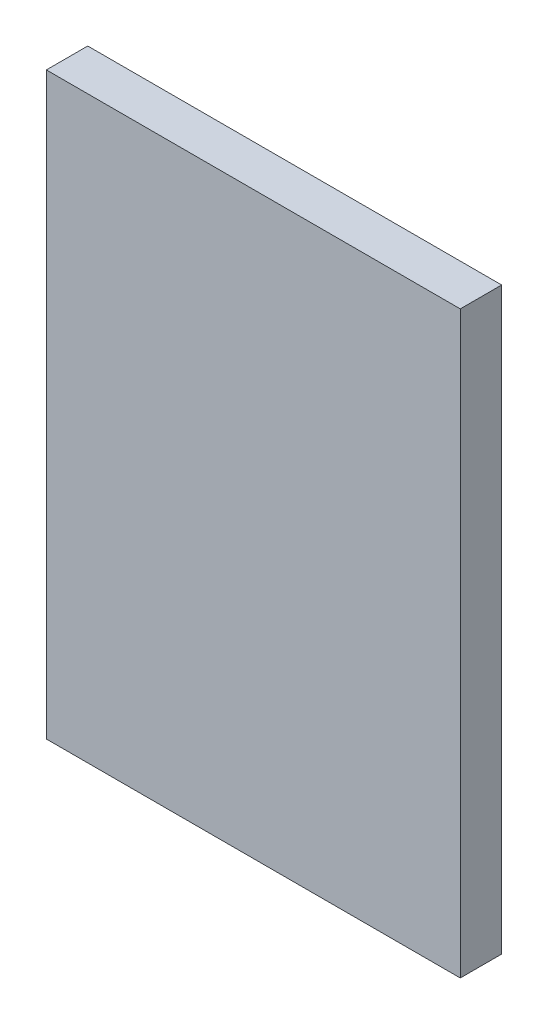
ISO-10303-21;
HEADER;
FILE_DESCRIPTION(('STEP AP214'),'2;1');
FILE_NAME('part.step','',(''),(''),'','','');
FILE_SCHEMA(('AUTOMOTIVE_DESIGN { 1 0 10303 214 1 1 1 1 }'));
ENDSEC;
DATA;
#1=APPLICATION_CONTEXT('core data for automotive mechanical design processes');
#2=APPLICATION_PROTOCOL_DEFINITION('international standard','automotive_design',2000,#1);
#3=PRODUCT_CONTEXT('',#1,'mechanical');
#4=PRODUCT('Part','Part','',(#3));
#5=PRODUCT_RELATED_PRODUCT_CATEGORY('part','',(#4));
#6=PRODUCT_DEFINITION_FORMATION('','',#4);
#7=PRODUCT_DEFINITION_CONTEXT('part definition',#1,'design');
#8=PRODUCT_DEFINITION('design','',#6,#7);
#9=PRODUCT_DEFINITION_SHAPE('','',#8);
#10=(LENGTH_UNIT() NAMED_UNIT(*) SI_UNIT(.MILLI.,.METRE.));
#11=(NAMED_UNIT(*) PLANE_ANGLE_UNIT() SI_UNIT($,.RADIAN.));
#12=(NAMED_UNIT(*) SI_UNIT($,.STERADIAN.) SOLID_ANGLE_UNIT());
#13=UNCERTAINTY_MEASURE_WITH_UNIT(LENGTH_MEASURE(1.E-05),#10,'distance_accuracy_value','');
#14=(GEOMETRIC_REPRESENTATION_CONTEXT(3) GLOBAL_UNCERTAINTY_ASSIGNED_CONTEXT((#13)) GLOBAL_UNIT_ASSIGNED_CONTEXT((#10,
#11,#12)) REPRESENTATION_CONTEXT('',''));
#15=CARTESIAN_POINT('',(0.,0.,0.));
#16=DIRECTION('',(0.,0.,1.));
#17=DIRECTION('',(1.,0.,0.));
#18=AXIS2_PLACEMENT_3D('',#15,#16,#17);
#19=CARTESIAN_POINT('',(0.,0.,50.));
#20=DIRECTION('',(1.,0.,0.));
#21=DIRECTION('',(0.,0.,-1.));
#22=AXIS2_PLACEMENT_3D('',#19,#20,#21);
#23=PLANE('',#22);
#24=DIRECTION('',(0.,-1.,0.));
#25=VECTOR('',#24,1.);
#26=CARTESIAN_POINT('',(0.,0.,0.));
#27=LINE('',#26,#25);
#28=CARTESIAN_POINT('',(0.,700.,0.));
#29=VERTEX_POINT('',#28);
#30=CARTESIAN_POINT('',(0.,0.,0.));
#31=VERTEX_POINT('',#30);
#32=EDGE_CURVE('E111',#29,#31,#27,.T.);
#33=ORIENTED_EDGE('',*,*,#32,.T.);
#34=DIRECTION('',(0.,0.,-1.));
#35=VECTOR('',#34,1.);
#36=CARTESIAN_POINT('',(0.,0.,50.));
#37=LINE('',#36,#35);
#38=CARTESIAN_POINT('',(0.,0.,50.));
#39=VERTEX_POINT('',#38);
#40=EDGE_CURVE('E11',#39,#31,#37,.T.);
#41=ORIENTED_EDGE('',*,*,#40,.F.);
#42=DIRECTION('',(0.,-1.,0.));
#43=VECTOR('',#42,1.);
#44=CARTESIAN_POINT('',(0.,0.,50.));
#45=LINE('',#44,#43);
#46=CARTESIAN_POINT('',(0.,700.,50.));
#47=VERTEX_POINT('',#46);
#48=EDGE_CURVE('E95',#47,#39,#45,.T.);
#49=ORIENTED_EDGE('',*,*,#48,.F.);
#50=DIRECTION('',(0.,0.,-1.));
#51=VECTOR('',#50,1.);
#52=CARTESIAN_POINT('',(0.,700.,50.));
#53=LINE('',#52,#51);
#54=EDGE_CURVE('E107',#47,#29,#53,.T.);
#55=ORIENTED_EDGE('',*,*,#54,.T.);
#56=EDGE_LOOP('',(#33,#41,#49,#55));
#57=FACE_BOUND('',#56,.T.);
#58=ADVANCED_FACE('F43',(#57),#23,.F.);
#59=CARTESIAN_POINT('',(0.,0.,50.));
#60=DIRECTION('',(0.,1.,0.));
#61=DIRECTION('',(0.,0.,1.));
#62=AXIS2_PLACEMENT_3D('',#59,#60,#61);
#63=PLANE('',#62);
#64=DIRECTION('',(1.,0.,0.));
#65=VECTOR('',#64,1.);
#66=CARTESIAN_POINT('',(0.,0.,0.));
#67=LINE('',#66,#65);
#68=CARTESIAN_POINT('',(500.,0.,0.));
#69=VERTEX_POINT('',#68);
#70=EDGE_CURVE('E100',#31,#69,#67,.T.);
#71=ORIENTED_EDGE('',*,*,#70,.T.);
#72=DIRECTION('',(0.,0.,-1.));
#73=VECTOR('',#72,1.);
#74=CARTESIAN_POINT('',(500.,0.,50.));
#75=LINE('',#74,#73);
#76=CARTESIAN_POINT('',(500.,0.,50.));
#77=VERTEX_POINT('',#76);
#78=EDGE_CURVE('E52',#77,#69,#75,.T.);
#79=ORIENTED_EDGE('',*,*,#78,.F.);
#80=DIRECTION('',(1.,0.,0.));
#81=VECTOR('',#80,1.);
#82=CARTESIAN_POINT('',(0.,0.,50.));
#83=LINE('',#82,#81);
#84=EDGE_CURVE('E90',#39,#77,#83,.T.);
#85=ORIENTED_EDGE('',*,*,#84,.F.);
#86=ORIENTED_EDGE('',*,*,#40,.T.);
#87=EDGE_LOOP('',(#71,#79,#85,#86));
#88=FACE_BOUND('',#87,.T.);
#89=ADVANCED_FACE('F99',(#88),#63,.F.);
#90=CARTESIAN_POINT('',(500.,0.,50.));
#91=DIRECTION('',(-1.,0.,0.));
#92=DIRECTION('',(0.,0.,1.));
#93=AXIS2_PLACEMENT_3D('',#90,#91,#92);
#94=PLANE('',#93);
#95=DIRECTION('',(0.,1.,0.));
#96=VECTOR('',#95,1.);
#97=CARTESIAN_POINT('',(500.,0.,0.));
#98=LINE('',#97,#96);
#99=CARTESIAN_POINT('',(500.,700.,0.));
#100=VERTEX_POINT('',#99);
#101=EDGE_CURVE('E77',#69,#100,#98,.T.);
#102=ORIENTED_EDGE('',*,*,#101,.T.);
#103=DIRECTION('',(0.,0.,-1.));
#104=VECTOR('',#103,1.);
#105=CARTESIAN_POINT('',(500.,700.,50.));
#106=LINE('',#105,#104);
#107=CARTESIAN_POINT('',(500.,700.,50.));
#108=VERTEX_POINT('',#107);
#109=EDGE_CURVE('E102',#108,#100,#106,.T.);
#110=ORIENTED_EDGE('',*,*,#109,.F.);
#111=DIRECTION('',(0.,1.,0.));
#112=VECTOR('',#111,1.);
#113=CARTESIAN_POINT('',(500.,0.,50.));
#114=LINE('',#113,#112);
#115=EDGE_CURVE('E93',#77,#108,#114,.T.);
#116=ORIENTED_EDGE('',*,*,#115,.F.);
#117=ORIENTED_EDGE('',*,*,#78,.T.);
#118=EDGE_LOOP('',(#102,#110,#116,#117));
#119=FACE_BOUND('',#118,.T.);
#120=ADVANCED_FACE('F103',(#119),#94,.F.);
#121=CARTESIAN_POINT('',(0.,700.,50.));
#122=DIRECTION('',(0.,-1.,0.));
#123=DIRECTION('',(0.,0.,-1.));
#124=AXIS2_PLACEMENT_3D('',#121,#122,#123);
#125=PLANE('',#124);
#126=DIRECTION('',(-1.,0.,0.));
#127=VECTOR('',#126,1.);
#128=CARTESIAN_POINT('',(0.,700.,0.));
#129=LINE('',#128,#127);
#130=EDGE_CURVE('E83',#100,#29,#129,.T.);
#131=ORIENTED_EDGE('',*,*,#130,.T.);
#132=ORIENTED_EDGE('',*,*,#54,.F.);
#133=DIRECTION('',(-1.,0.,0.));
#134=VECTOR('',#133,1.);
#135=CARTESIAN_POINT('',(0.,700.,50.));
#136=LINE('',#135,#134);
#137=EDGE_CURVE('E60',#108,#47,#136,.T.);
#138=ORIENTED_EDGE('',*,*,#137,.F.);
#139=ORIENTED_EDGE('',*,*,#109,.T.);
#140=EDGE_LOOP('',(#131,#132,#138,#139));
#141=FACE_BOUND('',#140,.T.);
#142=ADVANCED_FACE('F124',(#141),#125,.F.);
#143=CARTESIAN_POINT('',(0.,0.,50.));
#144=DIRECTION('',(0.,0.,-1.));
#145=DIRECTION('',(-1.,0.,0.));
#146=AXIS2_PLACEMENT_3D('',#143,#144,#145);
#147=PLANE('',#146);
#148=ORIENTED_EDGE('',*,*,#48,.T.);
#149=ORIENTED_EDGE('',*,*,#84,.T.);
#150=ORIENTED_EDGE('',*,*,#115,.T.);
#151=ORIENTED_EDGE('',*,*,#137,.T.);
#152=EDGE_LOOP('',(#148,#149,#150,#151));
#153=FACE_BOUND('',#152,.T.);
#154=ADVANCED_FACE('F91',(#153),#147,.F.);
#155=CARTESIAN_POINT('',(0.,0.,0.));
#156=DIRECTION('',(0.,0.,-1.));
#157=DIRECTION('',(-1.,0.,0.));
#158=AXIS2_PLACEMENT_3D('',#155,#156,#157);
#159=PLANE('',#158);
#160=ORIENTED_EDGE('',*,*,#32,.F.);
#161=ORIENTED_EDGE('',*,*,#130,.F.);
#162=ORIENTED_EDGE('',*,*,#101,.F.);
#163=ORIENTED_EDGE('',*,*,#70,.F.);
#164=EDGE_LOOP('',(#160,#161,#162,#163));
#165=FACE_BOUND('',#164,.T.);
#166=ADVANCED_FACE('F127',(#165),#159,.T.);
#167=CLOSED_SHELL('',(#58,#89,#120,#142,#154,#166));
#168=MANIFOLD_SOLID_BREP('B2',#167);
#169=ADVANCED_BREP_SHAPE_REPRESENTATION('',(#18,#168),#14);
#170=SHAPE_DEFINITION_REPRESENTATION(#9,#169);
ENDSEC;
END-ISO-10303-21;
